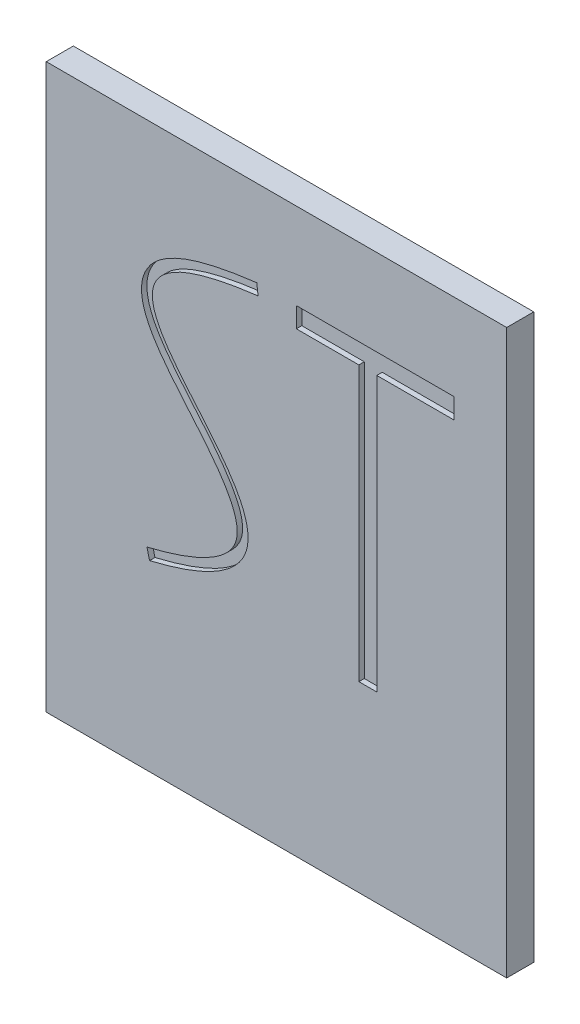
ISO-10303-21;
HEADER;
FILE_DESCRIPTION(('STEP AP214'),'2;1');
FILE_NAME('part.step','',(''),(''),'','','');
FILE_SCHEMA(('AUTOMOTIVE_DESIGN { 1 0 10303 214 1 1 1 1 }'));
ENDSEC;
DATA;
#1=APPLICATION_CONTEXT('core data for automotive mechanical design processes');
#2=APPLICATION_PROTOCOL_DEFINITION('international standard','automotive_design',2000,#1);
#3=PRODUCT_CONTEXT('',#1,'mechanical');
#4=PRODUCT('Part','Part','',(#3));
#5=PRODUCT_RELATED_PRODUCT_CATEGORY('part','',(#4));
#6=PRODUCT_DEFINITION_FORMATION('','',#4);
#7=PRODUCT_DEFINITION_CONTEXT('part definition',#1,'design');
#8=PRODUCT_DEFINITION('design','',#6,#7);
#9=PRODUCT_DEFINITION_SHAPE('','',#8);
#10=(LENGTH_UNIT() NAMED_UNIT(*) SI_UNIT(.MILLI.,.METRE.));
#11=(NAMED_UNIT(*) PLANE_ANGLE_UNIT() SI_UNIT($,.RADIAN.));
#12=(NAMED_UNIT(*) SI_UNIT($,.STERADIAN.) SOLID_ANGLE_UNIT());
#13=UNCERTAINTY_MEASURE_WITH_UNIT(LENGTH_MEASURE(1.E-05),#10,'distance_accuracy_value','');
#14=(GEOMETRIC_REPRESENTATION_CONTEXT(3) GLOBAL_UNCERTAINTY_ASSIGNED_CONTEXT((#13)) GLOBAL_UNIT_ASSIGNED_CONTEXT((#10,
#11,#12)) REPRESENTATION_CONTEXT('',''));
#15=CARTESIAN_POINT('',(0.,0.,0.));
#16=DIRECTION('',(0.,0.,1.));
#17=DIRECTION('',(1.,0.,0.));
#18=AXIS2_PLACEMENT_3D('',#15,#16,#17);
#19=CARTESIAN_POINT('',(-42.5,52.,5.));
#20=DIRECTION('',(1.,0.,0.));
#21=DIRECTION('',(0.,1.,0.));
#22=AXIS2_PLACEMENT_3D('',#19,#20,#21);
#23=PLANE('',#22);
#24=DIRECTION('',(0.,-1.,0.));
#25=VECTOR('',#24,1.);
#26=CARTESIAN_POINT('',(-42.5,52.,0.));
#27=LINE('',#26,#25);
#28=CARTESIAN_POINT('',(-42.5,52.,0.));
#29=VERTEX_POINT('',#28);
#30=CARTESIAN_POINT('',(-42.5,-52.,0.));
#31=VERTEX_POINT('',#30);
#32=EDGE_CURVE('E249',#29,#31,#27,.T.);
#33=ORIENTED_EDGE('',*,*,#32,.T.);
#34=DIRECTION('',(0.,0.,-1.));
#35=VECTOR('',#34,1.);
#36=CARTESIAN_POINT('',(-42.5,-52.,5.));
#37=LINE('',#36,#35);
#38=CARTESIAN_POINT('',(-42.5,-52.,5.));
#39=VERTEX_POINT('',#38);
#40=EDGE_CURVE('E11',#39,#31,#37,.T.);
#41=ORIENTED_EDGE('',*,*,#40,.F.);
#42=DIRECTION('',(0.,-1.,0.));
#43=VECTOR('',#42,1.);
#44=CARTESIAN_POINT('',(-42.5,52.,5.));
#45=LINE('',#44,#43);
#46=CARTESIAN_POINT('',(-42.5,52.,5.));
#47=VERTEX_POINT('',#46);
#48=EDGE_CURVE('E258',#47,#39,#45,.T.);
#49=ORIENTED_EDGE('',*,*,#48,.F.);
#50=DIRECTION('',(0.,0.,-1.));
#51=VECTOR('',#50,1.);
#52=CARTESIAN_POINT('',(-42.5,52.,5.));
#53=LINE('',#52,#51);
#54=EDGE_CURVE('E262',#47,#29,#53,.T.);
#55=ORIENTED_EDGE('',*,*,#54,.T.);
#56=EDGE_LOOP('',(#33,#41,#49,#55));
#57=FACE_BOUND('',#56,.T.);
#58=ADVANCED_FACE('F33',(#57),#23,.F.);
#59=CARTESIAN_POINT('',(42.5,-52.,5.));
#60=DIRECTION('',(0.,1.,0.));
#61=DIRECTION('',(-1.,0.,0.));
#62=AXIS2_PLACEMENT_3D('',#59,#60,#61);
#63=PLANE('',#62);
#64=DIRECTION('',(1.,0.,0.));
#65=VECTOR('',#64,1.);
#66=CARTESIAN_POINT('',(42.5,-52.,0.));
#67=LINE('',#66,#65);
#68=CARTESIAN_POINT('',(42.5,-52.,0.));
#69=VERTEX_POINT('',#68);
#70=EDGE_CURVE('E241',#31,#69,#67,.T.);
#71=ORIENTED_EDGE('',*,*,#70,.T.);
#72=DIRECTION('',(0.,0.,-1.));
#73=VECTOR('',#72,1.);
#74=CARTESIAN_POINT('',(42.5,-52.,5.));
#75=LINE('',#74,#73);
#76=CARTESIAN_POINT('',(42.5,-52.,5.));
#77=VERTEX_POINT('',#76);
#78=EDGE_CURVE('E40',#77,#69,#75,.T.);
#79=ORIENTED_EDGE('',*,*,#78,.F.);
#80=DIRECTION('',(1.,0.,0.));
#81=VECTOR('',#80,1.);
#82=CARTESIAN_POINT('',(42.5,-52.,5.));
#83=LINE('',#82,#81);
#84=EDGE_CURVE('E272',#39,#77,#83,.T.);
#85=ORIENTED_EDGE('',*,*,#84,.F.);
#86=ORIENTED_EDGE('',*,*,#40,.T.);
#87=EDGE_LOOP('',(#71,#79,#85,#86));
#88=FACE_BOUND('',#87,.T.);
#89=ADVANCED_FACE('F232',(#88),#63,.F.);
#90=CARTESIAN_POINT('',(42.5,52.,5.));
#91=DIRECTION('',(-1.,0.,0.));
#92=DIRECTION('',(0.,-1.,0.));
#93=AXIS2_PLACEMENT_3D('',#90,#91,#92);
#94=PLANE('',#93);
#95=DIRECTION('',(0.,1.,0.));
#96=VECTOR('',#95,1.);
#97=CARTESIAN_POINT('',(42.5,52.,0.));
#98=LINE('',#97,#96);
#99=CARTESIAN_POINT('',(42.5,52.,0.));
#100=VERTEX_POINT('',#99);
#101=EDGE_CURVE('E248',#69,#100,#98,.T.);
#102=ORIENTED_EDGE('',*,*,#101,.T.);
#103=DIRECTION('',(0.,0.,-1.));
#104=VECTOR('',#103,1.);
#105=CARTESIAN_POINT('',(42.5,52.,5.));
#106=LINE('',#105,#104);
#107=CARTESIAN_POINT('',(42.5,52.,5.));
#108=VERTEX_POINT('',#107);
#109=EDGE_CURVE('E254',#108,#100,#106,.T.);
#110=ORIENTED_EDGE('',*,*,#109,.F.);
#111=DIRECTION('',(0.,1.,0.));
#112=VECTOR('',#111,1.);
#113=CARTESIAN_POINT('',(42.5,52.,5.));
#114=LINE('',#113,#112);
#115=EDGE_CURVE('E253',#77,#108,#114,.T.);
#116=ORIENTED_EDGE('',*,*,#115,.F.);
#117=ORIENTED_EDGE('',*,*,#78,.T.);
#118=EDGE_LOOP('',(#102,#110,#116,#117));
#119=FACE_BOUND('',#118,.T.);
#120=ADVANCED_FACE('F229',(#119),#94,.F.);
#121=CARTESIAN_POINT('',(42.5,52.,5.));
#122=DIRECTION('',(0.,-1.,0.));
#123=DIRECTION('',(1.,0.,0.));
#124=AXIS2_PLACEMENT_3D('',#121,#122,#123);
#125=PLANE('',#124);
#126=DIRECTION('',(-1.,0.,0.));
#127=VECTOR('',#126,1.);
#128=CARTESIAN_POINT('',(42.5,52.,0.));
#129=LINE('',#128,#127);
#130=EDGE_CURVE('E256',#100,#29,#129,.T.);
#131=ORIENTED_EDGE('',*,*,#130,.T.);
#132=ORIENTED_EDGE('',*,*,#54,.F.);
#133=DIRECTION('',(-1.,0.,0.));
#134=VECTOR('',#133,1.);
#135=CARTESIAN_POINT('',(42.5,52.,5.));
#136=LINE('',#135,#134);
#137=EDGE_CURVE('E265',#108,#47,#136,.T.);
#138=ORIENTED_EDGE('',*,*,#137,.F.);
#139=ORIENTED_EDGE('',*,*,#109,.T.);
#140=EDGE_LOOP('',(#131,#132,#138,#139));
#141=FACE_BOUND('',#140,.T.);
#142=ADVANCED_FACE('F222',(#141),#125,.F.);
#143=CARTESIAN_POINT('',(0.,0.,5.));
#144=DIRECTION('',(0.,0.,-1.));
#145=DIRECTION('',(-1.,0.,0.));
#146=AXIS2_PLACEMENT_3D('',#143,#144,#145);
#147=PLANE('',#146);
#148=DIRECTION('',(-0.120333759553319,0.992733492087259,0.));
#149=VECTOR('',#148,1.);
#150=CARTESIAN_POINT('',(-3.38870474263694,34.103347729091,5.));
#151=LINE('',#150,#149);
#152=CARTESIAN_POINT('',(-3.38870474263694,34.103347729091,5.));
#153=VERTEX_POINT('',#152);
#154=CARTESIAN_POINT('',(-3.62937226174358,36.0888147132655,5.));
#155=VERTEX_POINT('',#154);
#156=EDGE_CURVE('E360',#153,#155,#151,.T.);
#157=ORIENTED_EDGE('',*,*,#156,.F.);
#158=CARTESIAN_POINT('',(-23.43253279483,-18.2413255295138,5.));
#159=CARTESIAN_POINT('',(2.01607131409988,-12.1385470955328,5.));
#160=CARTESIAN_POINT('',(-10.8845290802595,9.3194647704022,5.));
#161=CARTESIAN_POINT('',(-33.854005817453,30.4105094764514,5.));
#162=CARTESIAN_POINT('',(-3.38870474263694,34.103347729091,5.));
#163=B_SPLINE_CURVE_WITH_KNOTS('',3,(#158,#159,#160,#161,#162),.UNSPECIFIED.,.F.,.F.,(4,1,4),
(0.,0.478001068492098,1.),.UNSPECIFIED.);
#164=CARTESIAN_POINT('',(-23.43253279483,-18.2413255295138,5.));
#165=VERTEX_POINT('',#164);
#166=EDGE_CURVE('E47',#165,#153,#163,.T.);
#167=ORIENTED_EDGE('',*,*,#166,.F.);
#168=DIRECTION('',(0.233196395536751,-0.972429658694482,0.));
#169=VECTOR('',#168,1.);
#170=CARTESIAN_POINT('',(-23.43253279483,-18.2413255295138,5.));
#171=LINE('',#170,#169);
#172=CARTESIAN_POINT('',(-23.8989255859035,-16.2964662121248,5.));
#173=VERTEX_POINT('',#172);
#174=EDGE_CURVE('E165',#173,#165,#171,.T.);
#175=ORIENTED_EDGE('',*,*,#174,.F.);
#176=CARTESIAN_POINT('',(-3.62937226174358,36.0888147132655,5.));
#177=CARTESIAN_POINT('',(-4.08446722985846,36.0336505741451,5.));
#178=CARTESIAN_POINT('',(-5.00670154157965,35.9161816997084,5.));
#179=CARTESIAN_POINT('',(-6.74649730713708,35.6714644184049,5.));
#180=CARTESIAN_POINT('',(-8.79861964181203,35.3387641730803,5.));
#181=CARTESIAN_POINT('',(-11.0513158291835,34.8995533031449,5.));
#182=CARTESIAN_POINT('',(-13.7946069991673,34.2594819610476,5.));
#183=CARTESIAN_POINT('',(-16.7560380017881,33.3558099034237,5.));
#184=CARTESIAN_POINT('',(-20.5884652333188,31.6726006736871,5.));
#185=CARTESIAN_POINT('',(-23.2488732744481,29.5374035048495,5.));
#186=CARTESIAN_POINT('',(-24.6679200322021,26.7861989921569,5.));
#187=CARTESIAN_POINT('',(-25.0125103644622,24.5841159974858,5.));
#188=CARTESIAN_POINT('',(-24.7506979324145,22.4317833493676,5.));
#189=CARTESIAN_POINT('',(-23.8167044132251,19.6776702949651,5.));
#190=CARTESIAN_POINT('',(-21.8455710596814,16.3580997994744,5.));
#191=CARTESIAN_POINT('',(-18.7292995990211,12.3792978223498,5.));
#192=CARTESIAN_POINT('',(-15.2979781728977,8.39315793373713,5.));
#193=CARTESIAN_POINT('',(-12.0200289598183,4.45965574678264,5.));
#194=CARTESIAN_POINT('',(-9.30494710148428,0.658444927457637,5.));
#195=CARTESIAN_POINT('',(-7.54803007873414,-2.8725960941056,5.));
#196=CARTESIAN_POINT('',(-7.12946984451975,-5.36622048769444,5.));
#197=CARTESIAN_POINT('',(-7.41085697969758,-7.09943170201988,5.));
#198=CARTESIAN_POINT('',(-7.95661578463429,-8.3711541770756,5.));
#199=CARTESIAN_POINT('',(-8.94555614572284,-9.69017276280953,5.));
#200=CARTESIAN_POINT('',(-10.5013106866031,-11.0608125444732,5.));
#201=CARTESIAN_POINT('',(-12.7101209117546,-12.4435862603068,5.));
#202=CARTESIAN_POINT('',(-15.1411179131418,-13.5723736460543,5.));
#203=CARTESIAN_POINT('',(-17.4624065497719,-14.4465207254785,5.));
#204=CARTESIAN_POINT('',(-19.3954270865447,-15.0846384871877,5.));
#205=CARTESIAN_POINT('',(-21.1750730924472,-15.6008481563042,5.));
#206=CARTESIAN_POINT('',(-22.6926449228618,-16.00105941705,5.));
#207=CARTESIAN_POINT('',(-23.5001948788411,-16.2008474053089,5.));
#208=CARTESIAN_POINT('',(-23.8989255859035,-16.2964662121248,5.));
#209=B_SPLINE_CURVE_WITH_KNOTS('',3,(#176,#177,#178,#179,#180,#181,#182,#183,#184,#185,#186,
#187,#188,#189,#190,#191,#192,#193,#194,#195,#196,#197,#198,#199,#200,#201,#202,#203,#204,#205,
#206,#207,#208),.UNSPECIFIED.,.F.,.F.,(4,1,1,1,1,1,1,1,1,1,1,1,1,1,1,1,1,1,1,1,1,1,1,1,1,1,1,1,
1,1,4),(0.,0.0078125,0.015625,0.03125,0.046875,0.0625,0.09375,0.125,0.1875,0.21875,0.25,0.28125,
0.3125,0.375,0.4375,0.5,0.5625,0.625,0.6875,0.75,0.78125,0.8125,0.84375,0.875,0.90625,0.9375,
0.953125,0.96875,0.984375,0.9921875,1.),.UNSPECIFIED.);
#210=EDGE_CURVE('E168',#155,#173,#209,.T.);
#211=ORIENTED_EDGE('',*,*,#210,.F.);
#212=EDGE_LOOP('',(#157,#167,#175,#211));
#213=FACE_BOUND('',#212,.T.);
#214=DIRECTION('',(1.,0.,0.));
#215=VECTOR('',#214,1.);
#216=CARTESIAN_POINT('',(15.2131212914127,32.372945307319,5.));
#217=LINE('',#216,#215);
#218=CARTESIAN_POINT('',(3.67710514626562,32.372945307319,5.));
#219=VERTEX_POINT('',#218);
#220=CARTESIAN_POINT('',(15.2131212914127,32.372945307319,5.));
#221=VERTEX_POINT('',#220);
#222=EDGE_CURVE('E309',#219,#221,#217,.T.);
#223=ORIENTED_EDGE('',*,*,#222,.F.);
#224=DIRECTION('',(0.,-1.,0.));
#225=VECTOR('',#224,1.);
#226=CARTESIAN_POINT('',(3.67710514626562,32.372945307319,5.));
#227=LINE('',#226,#225);
#228=CARTESIAN_POINT('',(3.67710514626562,36.0888147132655,5.));
#229=VERTEX_POINT('',#228);
#230=EDGE_CURVE('E55',#229,#219,#227,.T.);
#231=ORIENTED_EDGE('',*,*,#230,.F.);
#232=DIRECTION('',(-1.,0.,0.));
#233=VECTOR('',#232,1.);
#234=CARTESIAN_POINT('',(3.67710514626562,36.0888147132655,5.));
#235=LINE('',#234,#233);
#236=CARTESIAN_POINT('',(32.8055459127619,36.0888147132655,5.));
#237=VERTEX_POINT('',#236);
#238=EDGE_CURVE('E286',#237,#229,#235,.T.);
#239=ORIENTED_EDGE('',*,*,#238,.F.);
#240=DIRECTION('',(0.,1.,0.));
#241=VECTOR('',#240,1.);
#242=CARTESIAN_POINT('',(32.8055459127619,36.0888147132655,5.));
#243=LINE('',#242,#241);
#244=CARTESIAN_POINT('',(32.8055459127619,32.348096386529,5.));
#245=VERTEX_POINT('',#244);
#246=EDGE_CURVE('E324',#245,#237,#243,.T.);
#247=ORIENTED_EDGE('',*,*,#246,.F.);
#248=DIRECTION('',(1.,0.,0.));
#249=VECTOR('',#248,1.);
#250=CARTESIAN_POINT('',(32.8055459127619,32.348096386529,5.));
#251=LINE('',#250,#249);
#252=CARTESIAN_POINT('',(18.5297259331425,32.348096386529,5.));
#253=VERTEX_POINT('',#252);
#254=EDGE_CURVE('E321',#253,#245,#251,.T.);
#255=ORIENTED_EDGE('',*,*,#254,.F.);
#256=DIRECTION('',(0.,1.,0.));
#257=VECTOR('',#256,1.);
#258=CARTESIAN_POINT('',(18.5297259331425,32.348096386529,5.));
#259=LINE('',#258,#257);
#260=CARTESIAN_POINT('',(18.5297259331425,-18.2661744503038,5.));
#261=VERTEX_POINT('',#260);
#262=EDGE_CURVE('E318',#261,#253,#259,.T.);
#263=ORIENTED_EDGE('',*,*,#262,.F.);
#264=DIRECTION('',(1.,0.,0.));
#265=VECTOR('',#264,1.);
#266=CARTESIAN_POINT('',(18.5297259331425,-18.2661744503038,5.));
#267=LINE('',#266,#265);
#268=CARTESIAN_POINT('',(15.2131212914127,-18.2661744503038,5.));
#269=VERTEX_POINT('',#268);
#270=EDGE_CURVE('E315',#269,#261,#267,.T.);
#271=ORIENTED_EDGE('',*,*,#270,.F.);
#272=DIRECTION('',(0.,-1.,0.));
#273=VECTOR('',#272,1.);
#274=CARTESIAN_POINT('',(15.2131212914127,-18.2661744503038,5.));
#275=LINE('',#274,#273);
#276=EDGE_CURVE('E312',#221,#269,#275,.T.);
#277=ORIENTED_EDGE('',*,*,#276,.F.);
#278=EDGE_LOOP('',(#223,#231,#239,#247,#255,#263,#271,#277));
#279=FACE_BOUND('',#278,.T.);
#280=ORIENTED_EDGE('',*,*,#48,.T.);
#281=ORIENTED_EDGE('',*,*,#84,.T.);
#282=ORIENTED_EDGE('',*,*,#115,.T.);
#283=ORIENTED_EDGE('',*,*,#137,.T.);
#284=EDGE_LOOP('',(#280,#281,#282,#283));
#285=FACE_BOUND('',#284,.T.);
#286=ADVANCED_FACE('F219',(#213,#279,#285),#147,.F.);
#287=CARTESIAN_POINT('',(0.,0.,0.));
#288=DIRECTION('',(0.,0.,-1.));
#289=DIRECTION('',(-1.,0.,0.));
#290=AXIS2_PLACEMENT_3D('',#287,#288,#289);
#291=PLANE('',#290);
#292=ORIENTED_EDGE('',*,*,#32,.F.);
#293=ORIENTED_EDGE('',*,*,#130,.F.);
#294=ORIENTED_EDGE('',*,*,#101,.F.);
#295=ORIENTED_EDGE('',*,*,#70,.F.);
#296=EDGE_LOOP('',(#292,#293,#294,#295));
#297=FACE_BOUND('',#296,.T.);
#298=ADVANCED_FACE('F218',(#297),#291,.T.);
#299=CARTESIAN_POINT('',(3.67710514626562,32.372945307319,4.));
#300=DIRECTION('',(-1.,0.,0.));
#301=DIRECTION('',(0.,0.,1.));
#302=AXIS2_PLACEMENT_3D('',#299,#300,#301);
#303=PLANE('',#302);
#304=ORIENTED_EDGE('',*,*,#230,.T.);
#305=DIRECTION('',(0.,0.,1.));
#306=VECTOR('',#305,1.);
#307=CARTESIAN_POINT('',(3.67710514626562,32.372945307319,4.));
#308=LINE('',#307,#306);
#309=CARTESIAN_POINT('',(3.67710514626562,32.372945307319,4.));
#310=VERTEX_POINT('',#309);
#311=EDGE_CURVE('E307',#310,#219,#308,.T.);
#312=ORIENTED_EDGE('',*,*,#311,.F.);
#313=DIRECTION('',(0.,-1.,0.));
#314=VECTOR('',#313,1.);
#315=CARTESIAN_POINT('',(3.67710514626562,32.372945307319,4.));
#316=LINE('',#315,#314);
#317=CARTESIAN_POINT('',(3.67710514626562,36.0888147132655,4.));
#318=VERTEX_POINT('',#317);
#319=EDGE_CURVE('E282',#318,#310,#316,.T.);
#320=ORIENTED_EDGE('',*,*,#319,.F.);
#321=DIRECTION('',(0.,0.,1.));
#322=VECTOR('',#321,1.);
#323=CARTESIAN_POINT('',(3.67710514626562,36.0888147132655,4.));
#324=LINE('',#323,#322);
#325=EDGE_CURVE('E329',#318,#229,#324,.T.);
#326=ORIENTED_EDGE('',*,*,#325,.T.);
#327=EDGE_LOOP('',(#304,#312,#320,#326));
#328=FACE_BOUND('',#327,.T.);
#329=ADVANCED_FACE('F192',(#328),#303,.F.);
#330=CARTESIAN_POINT('',(3.67710514626562,36.0888147132655,4.));
#331=DIRECTION('',(0.,1.,0.));
#332=DIRECTION('',(0.,0.,1.));
#333=AXIS2_PLACEMENT_3D('',#330,#331,#332);
#334=PLANE('',#333);
#335=ORIENTED_EDGE('',*,*,#238,.T.);
#336=ORIENTED_EDGE('',*,*,#325,.F.);
#337=DIRECTION('',(-1.,0.,0.));
#338=VECTOR('',#337,1.);
#339=CARTESIAN_POINT('',(3.67710514626562,36.0888147132655,4.));
#340=LINE('',#339,#338);
#341=CARTESIAN_POINT('',(32.8055459127619,36.0888147132655,4.));
#342=VERTEX_POINT('',#341);
#343=EDGE_CURVE('E304',#342,#318,#340,.T.);
#344=ORIENTED_EDGE('',*,*,#343,.F.);
#345=DIRECTION('',(0.,0.,1.));
#346=VECTOR('',#345,1.);
#347=CARTESIAN_POINT('',(32.8055459127619,36.0888147132655,4.));
#348=LINE('',#347,#346);
#349=EDGE_CURVE('E331',#342,#237,#348,.T.);
#350=ORIENTED_EDGE('',*,*,#349,.T.);
#351=EDGE_LOOP('',(#335,#336,#344,#350));
#352=FACE_BOUND('',#351,.T.);
#353=ADVANCED_FACE('F188',(#352),#334,.F.);
#354=CARTESIAN_POINT('',(32.8055459127619,36.0888147132655,4.));
#355=DIRECTION('',(1.,0.,0.));
#356=DIRECTION('',(0.,0.,-1.));
#357=AXIS2_PLACEMENT_3D('',#354,#355,#356);
#358=PLANE('',#357);
#359=ORIENTED_EDGE('',*,*,#246,.T.);
#360=ORIENTED_EDGE('',*,*,#349,.F.);
#361=DIRECTION('',(0.,1.,0.));
#362=VECTOR('',#361,1.);
#363=CARTESIAN_POINT('',(32.8055459127619,36.0888147132655,4.));
#364=LINE('',#363,#362);
#365=CARTESIAN_POINT('',(32.8055459127619,32.348096386529,4.));
#366=VERTEX_POINT('',#365);
#367=EDGE_CURVE('E301',#366,#342,#364,.T.);
#368=ORIENTED_EDGE('',*,*,#367,.F.);
#369=DIRECTION('',(0.,0.,1.));
#370=VECTOR('',#369,1.);
#371=CARTESIAN_POINT('',(32.8055459127619,32.348096386529,4.));
#372=LINE('',#371,#370);
#373=EDGE_CURVE('E333',#366,#245,#372,.T.);
#374=ORIENTED_EDGE('',*,*,#373,.T.);
#375=EDGE_LOOP('',(#359,#360,#368,#374));
#376=FACE_BOUND('',#375,.T.);
#377=ADVANCED_FACE('F191',(#376),#358,.F.);
#378=CARTESIAN_POINT('',(32.8055459127619,32.348096386529,4.));
#379=DIRECTION('',(0.,-1.,0.));
#380=DIRECTION('',(1.,0.,0.));
#381=AXIS2_PLACEMENT_3D('',#378,#379,#380);
#382=PLANE('',#381);
#383=ORIENTED_EDGE('',*,*,#254,.T.);
#384=ORIENTED_EDGE('',*,*,#373,.F.);
#385=DIRECTION('',(1.,0.,0.));
#386=VECTOR('',#385,1.);
#387=CARTESIAN_POINT('',(32.8055459127619,32.348096386529,4.));
#388=LINE('',#387,#386);
#389=CARTESIAN_POINT('',(18.5297259331425,32.348096386529,4.));
#390=VERTEX_POINT('',#389);
#391=EDGE_CURVE('E298',#390,#366,#388,.T.);
#392=ORIENTED_EDGE('',*,*,#391,.F.);
#393=DIRECTION('',(0.,0.,1.));
#394=VECTOR('',#393,1.);
#395=CARTESIAN_POINT('',(18.5297259331425,32.348096386529,4.));
#396=LINE('',#395,#394);
#397=EDGE_CURVE('E335',#390,#253,#396,.T.);
#398=ORIENTED_EDGE('',*,*,#397,.T.);
#399=EDGE_LOOP('',(#383,#384,#392,#398));
#400=FACE_BOUND('',#399,.T.);
#401=ADVANCED_FACE('F196',(#400),#382,.F.);
#402=CARTESIAN_POINT('',(18.5297259331425,32.348096386529,4.));
#403=DIRECTION('',(1.,0.,0.));
#404=DIRECTION('',(0.,1.,0.));
#405=AXIS2_PLACEMENT_3D('',#402,#403,#404);
#406=PLANE('',#405);
#407=ORIENTED_EDGE('',*,*,#262,.T.);
#408=ORIENTED_EDGE('',*,*,#397,.F.);
#409=DIRECTION('',(0.,1.,0.));
#410=VECTOR('',#409,1.);
#411=CARTESIAN_POINT('',(18.5297259331425,32.348096386529,4.));
#412=LINE('',#411,#410);
#413=CARTESIAN_POINT('',(18.5297259331425,-18.2661744503038,4.));
#414=VERTEX_POINT('',#413);
#415=EDGE_CURVE('E295',#414,#390,#412,.T.);
#416=ORIENTED_EDGE('',*,*,#415,.F.);
#417=DIRECTION('',(0.,0.,1.));
#418=VECTOR('',#417,1.);
#419=CARTESIAN_POINT('',(18.5297259331425,-18.2661744503038,4.));
#420=LINE('',#419,#418);
#421=EDGE_CURVE('E337',#414,#261,#420,.T.);
#422=ORIENTED_EDGE('',*,*,#421,.T.);
#423=EDGE_LOOP('',(#407,#408,#416,#422));
#424=FACE_BOUND('',#423,.T.);
#425=ADVANCED_FACE('F200',(#424),#406,.F.);
#426=CARTESIAN_POINT('',(18.5297259331425,-18.2661744503038,4.));
#427=DIRECTION('',(0.,-1.,0.));
#428=DIRECTION('',(0.,0.,-1.));
#429=AXIS2_PLACEMENT_3D('',#426,#427,#428);
#430=PLANE('',#429);
#431=ORIENTED_EDGE('',*,*,#270,.T.);
#432=ORIENTED_EDGE('',*,*,#421,.F.);
#433=DIRECTION('',(1.,0.,0.));
#434=VECTOR('',#433,1.);
#435=CARTESIAN_POINT('',(18.5297259331425,-18.2661744503038,4.));
#436=LINE('',#435,#434);
#437=CARTESIAN_POINT('',(15.2131212914127,-18.2661744503038,4.));
#438=VERTEX_POINT('',#437);
#439=EDGE_CURVE('E292',#438,#414,#436,.T.);
#440=ORIENTED_EDGE('',*,*,#439,.F.);
#441=DIRECTION('',(0.,0.,1.));
#442=VECTOR('',#441,1.);
#443=CARTESIAN_POINT('',(15.2131212914127,-18.2661744503038,4.));
#444=LINE('',#443,#442);
#445=EDGE_CURVE('E339',#438,#269,#444,.T.);
#446=ORIENTED_EDGE('',*,*,#445,.T.);
#447=EDGE_LOOP('',(#431,#432,#440,#446));
#448=FACE_BOUND('',#447,.T.);
#449=ADVANCED_FACE('F204',(#448),#430,.F.);
#450=CARTESIAN_POINT('',(15.2131212914127,-18.2661744503038,4.));
#451=DIRECTION('',(-1.,0.,0.));
#452=DIRECTION('',(0.,-1.,0.));
#453=AXIS2_PLACEMENT_3D('',#450,#451,#452);
#454=PLANE('',#453);
#455=ORIENTED_EDGE('',*,*,#276,.T.);
#456=ORIENTED_EDGE('',*,*,#445,.F.);
#457=DIRECTION('',(0.,-1.,0.));
#458=VECTOR('',#457,1.);
#459=CARTESIAN_POINT('',(15.2131212914127,-18.2661744503038,4.));
#460=LINE('',#459,#458);
#461=CARTESIAN_POINT('',(15.2131212914127,32.372945307319,4.));
#462=VERTEX_POINT('',#461);
#463=EDGE_CURVE('E289',#462,#438,#460,.T.);
#464=ORIENTED_EDGE('',*,*,#463,.F.);
#465=DIRECTION('',(0.,0.,1.));
#466=VECTOR('',#465,1.);
#467=CARTESIAN_POINT('',(15.2131212914127,32.372945307319,4.));
#468=LINE('',#467,#466);
#469=EDGE_CURVE('E341',#462,#221,#468,.T.);
#470=ORIENTED_EDGE('',*,*,#469,.T.);
#471=EDGE_LOOP('',(#455,#456,#464,#470));
#472=FACE_BOUND('',#471,.T.);
#473=ADVANCED_FACE('F208',(#472),#454,.F.);
#474=CARTESIAN_POINT('',(15.2131212914127,32.372945307319,4.));
#475=DIRECTION('',(0.,-1.,0.));
#476=DIRECTION('',(0.,0.,-1.));
#477=AXIS2_PLACEMENT_3D('',#474,#475,#476);
#478=PLANE('',#477);
#479=ORIENTED_EDGE('',*,*,#222,.T.);
#480=ORIENTED_EDGE('',*,*,#469,.F.);
#481=DIRECTION('',(1.,0.,0.));
#482=VECTOR('',#481,1.);
#483=CARTESIAN_POINT('',(15.2131212914127,32.372945307319,4.));
#484=LINE('',#483,#482);
#485=EDGE_CURVE('E285',#310,#462,#484,.T.);
#486=ORIENTED_EDGE('',*,*,#485,.F.);
#487=ORIENTED_EDGE('',*,*,#311,.T.);
#488=EDGE_LOOP('',(#479,#480,#486,#487));
#489=FACE_BOUND('',#488,.T.);
#490=ADVANCED_FACE('F186',(#489),#478,.F.);
#491=CARTESIAN_POINT('',(0.,0.,4.));
#492=DIRECTION('',(0.,0.,-1.));
#493=DIRECTION('',(-1.,0.,0.));
#494=AXIS2_PLACEMENT_3D('',#491,#492,#493);
#495=PLANE('',#494);
#496=ORIENTED_EDGE('',*,*,#319,.T.);
#497=ORIENTED_EDGE('',*,*,#485,.T.);
#498=ORIENTED_EDGE('',*,*,#463,.T.);
#499=ORIENTED_EDGE('',*,*,#439,.T.);
#500=ORIENTED_EDGE('',*,*,#415,.T.);
#501=ORIENTED_EDGE('',*,*,#391,.T.);
#502=ORIENTED_EDGE('',*,*,#367,.T.);
#503=ORIENTED_EDGE('',*,*,#343,.T.);
#504=EDGE_LOOP('',(#496,#497,#498,#499,#500,#501,#502,#503));
#505=FACE_BOUND('',#504,.T.);
#506=ADVANCED_FACE('F182',(#505),#495,.F.);
#507=CARTESIAN_POINT('',(-23.43253279483,-18.2413255295138,4.));
#508=CARTESIAN_POINT('',(2.01607131409988,-12.1385470955328,4.));
#509=CARTESIAN_POINT('',(-10.8845290802595,9.3194647704022,4.));
#510=CARTESIAN_POINT('',(-33.854005817453,30.4105094764514,4.));
#511=CARTESIAN_POINT('',(-3.38870474263694,34.103347729091,4.));
#512=B_SPLINE_CURVE_WITH_KNOTS('',3,(#507,#508,#509,#510,#511),.UNSPECIFIED.,.F.,.F.,(4,1,4),
(0.,0.478001068492098,1.),.UNSPECIFIED.);
#513=DIRECTION('',(0.,0.,1.));
#514=VECTOR('',#513,1.);
#515=SURFACE_OF_LINEAR_EXTRUSION('',#512,#514);
#516=ORIENTED_EDGE('',*,*,#166,.T.);
#517=DIRECTION('',(0.,0.,1.));
#518=VECTOR('',#517,1.);
#519=CARTESIAN_POINT('',(-3.38870474263694,34.103347729091,4.));
#520=LINE('',#519,#518);
#521=CARTESIAN_POINT('',(-3.38870474263694,34.103347729091,4.));
#522=VERTEX_POINT('',#521);
#523=EDGE_CURVE('E143',#522,#153,#520,.T.);
#524=ORIENTED_EDGE('',*,*,#523,.F.);
#525=CARTESIAN_POINT('',(-23.43253279483,-18.2413255295138,4.));
#526=VERTEX_POINT('',#525);
#527=EDGE_CURVE('E147',#526,#522,#512,.T.);
#528=ORIENTED_EDGE('',*,*,#527,.F.);
#529=DIRECTION('',(0.,0.,1.));
#530=VECTOR('',#529,1.);
#531=CARTESIAN_POINT('',(-23.43253279483,-18.2413255295138,4.));
#532=LINE('',#531,#530);
#533=EDGE_CURVE('E275',#526,#165,#532,.T.);
#534=ORIENTED_EDGE('',*,*,#533,.T.);
#535=EDGE_LOOP('',(#516,#524,#528,#534));
#536=FACE_BOUND('',#535,.T.);
#537=ADVANCED_FACE('F145',(#536),#515,.F.);
#538=CARTESIAN_POINT('',(-23.43253279483,-18.2413255295138,4.));
#539=DIRECTION('',(-0.972429658694482,-0.233196395536751,0.));
#540=DIRECTION('',(0.233196395536751,-0.972429658694482,0.));
#541=AXIS2_PLACEMENT_3D('',#538,#539,#540);
#542=PLANE('',#541);
#543=ORIENTED_EDGE('',*,*,#174,.T.);
#544=ORIENTED_EDGE('',*,*,#533,.F.);
#545=DIRECTION('',(0.233196395536751,-0.972429658694482,0.));
#546=VECTOR('',#545,1.);
#547=CARTESIAN_POINT('',(-23.43253279483,-18.2413255295138,4.));
#548=LINE('',#547,#546);
#549=CARTESIAN_POINT('',(-23.8989255859035,-16.2964662121248,4.));
#550=VERTEX_POINT('',#549);
#551=EDGE_CURVE('E153',#550,#526,#548,.T.);
#552=ORIENTED_EDGE('',*,*,#551,.F.);
#553=DIRECTION('',(0.,0.,1.));
#554=VECTOR('',#553,1.);
#555=CARTESIAN_POINT('',(-23.8989255859035,-16.2964662121248,4.));
#556=LINE('',#555,#554);
#557=EDGE_CURVE('E276',#550,#173,#556,.T.);
#558=ORIENTED_EDGE('',*,*,#557,.T.);
#559=EDGE_LOOP('',(#543,#544,#552,#558));
#560=FACE_BOUND('',#559,.T.);
#561=ADVANCED_FACE('F181',(#560),#542,.F.);
#562=CARTESIAN_POINT('',(-3.62937226174358,36.0888147132655,4.));
#563=CARTESIAN_POINT('',(-4.08446722985846,36.0336505741451,4.));
#564=CARTESIAN_POINT('',(-5.00670154157965,35.9161816997084,4.));
#565=CARTESIAN_POINT('',(-6.74649730713708,35.6714644184049,4.));
#566=CARTESIAN_POINT('',(-8.79861964181203,35.3387641730803,4.));
#567=CARTESIAN_POINT('',(-11.0513158291835,34.8995533031449,4.));
#568=CARTESIAN_POINT('',(-13.7946069991673,34.2594819610476,4.));
#569=CARTESIAN_POINT('',(-16.7560380017881,33.3558099034237,4.));
#570=CARTESIAN_POINT('',(-20.5884652333188,31.6726006736871,4.));
#571=CARTESIAN_POINT('',(-23.2488732744481,29.5374035048495,4.));
#572=CARTESIAN_POINT('',(-24.6679200322021,26.7861989921569,4.));
#573=CARTESIAN_POINT('',(-25.0125103644622,24.5841159974858,4.));
#574=CARTESIAN_POINT('',(-24.7506979324145,22.4317833493676,4.));
#575=CARTESIAN_POINT('',(-23.8167044132251,19.6776702949651,4.));
#576=CARTESIAN_POINT('',(-21.8455710596814,16.3580997994744,4.));
#577=CARTESIAN_POINT('',(-18.7292995990211,12.3792978223498,4.));
#578=CARTESIAN_POINT('',(-15.2979781728977,8.39315793373713,4.));
#579=CARTESIAN_POINT('',(-12.0200289598183,4.45965574678264,4.));
#580=CARTESIAN_POINT('',(-9.30494710148428,0.658444927457637,4.));
#581=CARTESIAN_POINT('',(-7.54803007873414,-2.8725960941056,4.));
#582=CARTESIAN_POINT('',(-7.12946984451975,-5.36622048769444,4.));
#583=CARTESIAN_POINT('',(-7.41085697969758,-7.09943170201988,4.));
#584=CARTESIAN_POINT('',(-7.95661578463429,-8.3711541770756,4.));
#585=CARTESIAN_POINT('',(-8.94555614572284,-9.69017276280953,4.));
#586=CARTESIAN_POINT('',(-10.5013106866031,-11.0608125444732,4.));
#587=CARTESIAN_POINT('',(-12.7101209117546,-12.4435862603068,4.));
#588=CARTESIAN_POINT('',(-15.1411179131418,-13.5723736460543,4.));
#589=CARTESIAN_POINT('',(-17.4624065497719,-14.4465207254785,4.));
#590=CARTESIAN_POINT('',(-19.3954270865447,-15.0846384871877,4.));
#591=CARTESIAN_POINT('',(-21.1750730924472,-15.6008481563042,4.));
#592=CARTESIAN_POINT('',(-22.6926449228618,-16.00105941705,4.));
#593=CARTESIAN_POINT('',(-23.5001948788411,-16.2008474053089,4.));
#594=CARTESIAN_POINT('',(-23.8989255859035,-16.2964662121248,4.));
#595=B_SPLINE_CURVE_WITH_KNOTS('',3,(#562,#563,#564,#565,#566,#567,#568,#569,#570,#571,#572,
#573,#574,#575,#576,#577,#578,#579,#580,#581,#582,#583,#584,#585,#586,#587,#588,#589,#590,#591,
#592,#593,#594),.UNSPECIFIED.,.F.,.F.,(4,1,1,1,1,1,1,1,1,1,1,1,1,1,1,1,1,1,1,1,1,1,1,1,1,1,1,1,
1,1,4),(0.,0.0078125,0.015625,0.03125,0.046875,0.0625,0.09375,0.125,0.1875,0.21875,0.25,0.28125,
0.3125,0.375,0.4375,0.5,0.5625,0.625,0.6875,0.75,0.78125,0.8125,0.84375,0.875,0.90625,0.9375,
0.953125,0.96875,0.984375,0.9921875,1.),.UNSPECIFIED.);
#596=DIRECTION('',(0.,0.,1.));
#597=VECTOR('',#596,1.);
#598=SURFACE_OF_LINEAR_EXTRUSION('',#595,#597);
#599=ORIENTED_EDGE('',*,*,#210,.T.);
#600=ORIENTED_EDGE('',*,*,#557,.F.);
#601=CARTESIAN_POINT('',(-3.62937226174358,36.0888147132655,4.));
#602=VERTEX_POINT('',#601);
#603=EDGE_CURVE('E161',#602,#550,#595,.T.);
#604=ORIENTED_EDGE('',*,*,#603,.F.);
#605=DIRECTION('',(0.,0.,1.));
#606=VECTOR('',#605,1.);
#607=CARTESIAN_POINT('',(-3.62937226174358,36.0888147132655,4.));
#608=LINE('',#607,#606);
#609=EDGE_CURVE('E152',#602,#155,#608,.T.);
#610=ORIENTED_EDGE('',*,*,#609,.T.);
#611=EDGE_LOOP('',(#599,#600,#604,#610));
#612=FACE_BOUND('',#611,.T.);
#613=ADVANCED_FACE('F378',(#612),#598,.F.);
#614=CARTESIAN_POINT('',(-3.38870474263694,34.103347729091,4.));
#615=DIRECTION('',(0.992733492087259,0.120333759553319,0.));
#616=DIRECTION('',(-0.120333759553319,0.992733492087259,0.));
#617=AXIS2_PLACEMENT_3D('',#614,#615,#616);
#618=PLANE('',#617);
#619=ORIENTED_EDGE('',*,*,#156,.T.);
#620=ORIENTED_EDGE('',*,*,#609,.F.);
#621=DIRECTION('',(-0.120333759553319,0.992733492087259,0.));
#622=VECTOR('',#621,1.);
#623=CARTESIAN_POINT('',(-3.38870474263694,34.103347729091,4.));
#624=LINE('',#623,#622);
#625=EDGE_CURVE('E156',#522,#602,#624,.T.);
#626=ORIENTED_EDGE('',*,*,#625,.F.);
#627=ORIENTED_EDGE('',*,*,#523,.T.);
#628=EDGE_LOOP('',(#619,#620,#626,#627));
#629=FACE_BOUND('',#628,.T.);
#630=ADVANCED_FACE('F157',(#629),#618,.F.);
#631=CARTESIAN_POINT('',(-13.7977895410434,9.69502210316453,4.));
#632=DIRECTION('',(0.,0.,-1.));
#633=DIRECTION('',(-1.,0.,0.));
#634=AXIS2_PLACEMENT_3D('',#631,#632,#633);
#635=PLANE('',#634);
#636=ORIENTED_EDGE('',*,*,#527,.T.);
#637=ORIENTED_EDGE('',*,*,#625,.T.);
#638=ORIENTED_EDGE('',*,*,#603,.T.);
#639=ORIENTED_EDGE('',*,*,#551,.T.);
#640=EDGE_LOOP('',(#636,#637,#638,#639));
#641=FACE_BOUND('',#640,.T.);
#642=ADVANCED_FACE('F163',(#641),#635,.F.);
#643=CLOSED_SHELL('',(#58,#89,#120,#142,#286,#298,#329,#353,#377,#401,#425,#449,#473,#490,#506,
#537,#561,#613,#630,#642));
#644=MANIFOLD_SOLID_BREP('B2',#643);
#645=ADVANCED_BREP_SHAPE_REPRESENTATION('',(#18,#644),#14);
#646=SHAPE_DEFINITION_REPRESENTATION(#9,#645);
ENDSEC;
END-ISO-10303-21;
